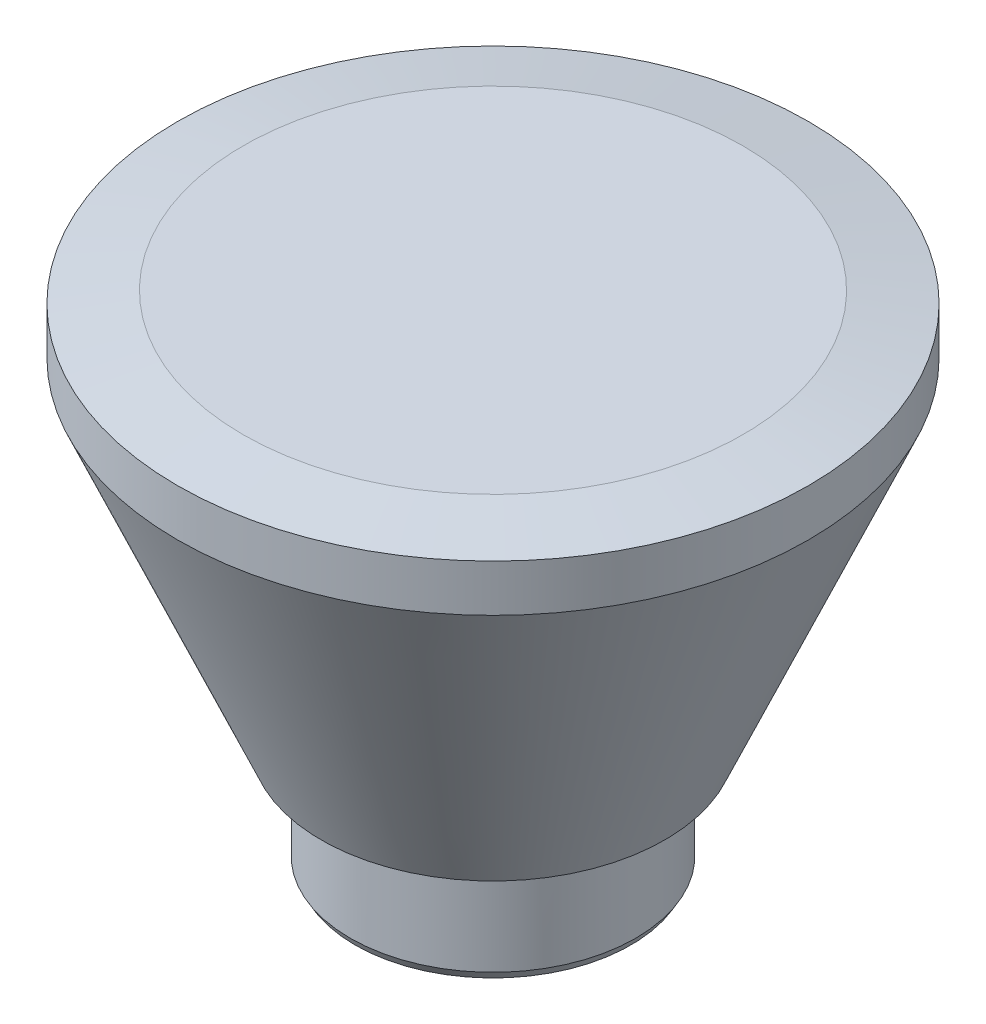
ISO-10303-21;
HEADER;
FILE_DESCRIPTION(('STEP AP214'),'2;1');
FILE_NAME('part.step','',(''),(''),'','','');
FILE_SCHEMA(('AUTOMOTIVE_DESIGN { 1 0 10303 214 1 1 1 1 }'));
ENDSEC;
DATA;
#1=APPLICATION_CONTEXT('core data for automotive mechanical design processes');
#2=APPLICATION_PROTOCOL_DEFINITION('international standard','automotive_design',2000,#1);
#3=PRODUCT_CONTEXT('',#1,'mechanical');
#4=PRODUCT('Part','Part','',(#3));
#5=PRODUCT_RELATED_PRODUCT_CATEGORY('part','',(#4));
#6=PRODUCT_DEFINITION_FORMATION('','',#4);
#7=PRODUCT_DEFINITION_CONTEXT('part definition',#1,'design');
#8=PRODUCT_DEFINITION('design','',#6,#7);
#9=PRODUCT_DEFINITION_SHAPE('','',#8);
#10=(LENGTH_UNIT() NAMED_UNIT(*) SI_UNIT(.MILLI.,.METRE.));
#11=(NAMED_UNIT(*) PLANE_ANGLE_UNIT() SI_UNIT($,.RADIAN.));
#12=(NAMED_UNIT(*) SI_UNIT($,.STERADIAN.) SOLID_ANGLE_UNIT());
#13=UNCERTAINTY_MEASURE_WITH_UNIT(LENGTH_MEASURE(1.E-05),#10,'distance_accuracy_value','');
#14=(GEOMETRIC_REPRESENTATION_CONTEXT(3) GLOBAL_UNCERTAINTY_ASSIGNED_CONTEXT((#13)) GLOBAL_UNIT_ASSIGNED_CONTEXT((#10,
#11,#12)) REPRESENTATION_CONTEXT('',''));
#15=CARTESIAN_POINT('',(0.,0.,0.));
#16=DIRECTION('',(0.,0.,1.));
#17=DIRECTION('',(1.,0.,0.));
#18=AXIS2_PLACEMENT_3D('',#15,#16,#17);
#19=CARTESIAN_POINT('',(0.,-1.57367102429958,0.));
#20=DIRECTION('',(0.,-1.,0.));
#21=DIRECTION('',(0.,0.,-1.));
#22=AXIS2_PLACEMENT_3D('',#19,#20,#21);
#23=CYLINDRICAL_SURFACE('',#22,19.);
#24=CARTESIAN_POINT('',(0.,22.4817362650327,0.));
#25=DIRECTION('',(0.,-1.,0.));
#26=DIRECTION('',(0.,0.,-1.));
#27=AXIS2_PLACEMENT_3D('',#24,#25,#26);
#28=CIRCLE('',#27,19.);
#29=CARTESIAN_POINT('',(0.,22.4817362650327,-19.));
#30=VERTEX_POINT('',#29);
#31=EDGE_CURVE('E245',#30,#30,#28,.T.);
#32=ORIENTED_EDGE('',*,*,#31,.T.);
#33=EDGE_LOOP('',(#32));
#34=FACE_BOUND('',#33,.T.);
#35=CARTESIAN_POINT('',(0.,19.6513289757004,0.));
#36=DIRECTION('',(0.,-1.,0.));
#37=DIRECTION('',(0.,0.,-1.));
#38=AXIS2_PLACEMENT_3D('',#35,#36,#37);
#39=CIRCLE('',#38,19.);
#40=CARTESIAN_POINT('',(0.,19.6513289757004,-19.));
#41=VERTEX_POINT('',#40);
#42=EDGE_CURVE('E273',#41,#41,#39,.T.);
#43=ORIENTED_EDGE('',*,*,#42,.F.);
#44=EDGE_LOOP('',(#43));
#45=FACE_BOUND('',#44,.T.);
#46=ADVANCED_FACE('F51',(#34,#45),#23,.T.);
#47=CARTESIAN_POINT('',(0.,19.6513289757004,0.));
#48=DIRECTION('',(0.,1.,0.));
#49=DIRECTION('',(0.,0.,1.));
#50=AXIS2_PLACEMENT_3D('',#47,#48,#49);
#51=CONICAL_SURFACE('',#50,19.,0.408661938833639);
#52=CARTESIAN_POINT('',(0.,-0.32367102429958,0.));
#53=DIRECTION('',(0.,-1.,0.));
#54=DIRECTION('',(0.,0.,-1.));
#55=AXIS2_PLACEMENT_3D('',#52,#53,#54);
#56=CIRCLE('',#55,10.35);
#57=CARTESIAN_POINT('',(0.,-0.32367102429958,-10.35));
#58=VERTEX_POINT('',#57);
#59=EDGE_CURVE('E269',#58,#58,#56,.T.);
#60=ORIENTED_EDGE('',*,*,#59,.F.);
#61=EDGE_LOOP('',(#60));
#62=FACE_BOUND('',#61,.T.);
#63=ORIENTED_EDGE('',*,*,#42,.T.);
#64=EDGE_LOOP('',(#63));
#65=FACE_BOUND('',#64,.T.);
#66=ADVANCED_FACE('F377',(#62,#65),#51,.T.);
#67=CARTESIAN_POINT('',(0.,-0.32367102429958,0.));
#68=DIRECTION('',(0.,1.,0.));
#69=DIRECTION('',(0.,0.,1.));
#70=AXIS2_PLACEMENT_3D('',#67,#68,#69);
#71=PLANE('',#70);
#72=CARTESIAN_POINT('',(0.,-0.32367102429958,0.));
#73=DIRECTION('',(0.,-1.,0.));
#74=DIRECTION('',(0.,0.,-1.));
#75=AXIS2_PLACEMENT_3D('',#72,#73,#74);
#76=CIRCLE('',#75,8.6);
#77=CARTESIAN_POINT('',(0.,-0.32367102429958,-8.6));
#78=VERTEX_POINT('',#77);
#79=EDGE_CURVE('E265',#78,#78,#76,.T.);
#80=ORIENTED_EDGE('',*,*,#79,.F.);
#81=EDGE_LOOP('',(#80));
#82=FACE_BOUND('',#81,.T.);
#83=ORIENTED_EDGE('',*,*,#59,.T.);
#84=EDGE_LOOP('',(#83));
#85=FACE_BOUND('',#84,.T.);
#86=ADVANCED_FACE('F373',(#82,#85),#71,.F.);
#87=CARTESIAN_POINT('',(0.,-1.57367102429958,0.));
#88=DIRECTION('',(0.,-1.,0.));
#89=DIRECTION('',(0.,0.,-1.));
#90=AXIS2_PLACEMENT_3D('',#87,#88,#89);
#91=CYLINDRICAL_SURFACE('',#90,8.6);
#92=CARTESIAN_POINT('',(0.,-6.3236710242996,0.));
#93=DIRECTION('',(0.,1.,0.));
#94=DIRECTION('',(0.,0.,1.));
#95=AXIS2_PLACEMENT_3D('',#92,#93,#94);
#96=CIRCLE('',#95,8.6);
#97=CARTESIAN_POINT('',(0.,-6.3236710242996,8.6));
#98=VERTEX_POINT('',#97);
#99=EDGE_CURVE('E11',#98,#98,#96,.T.);
#100=ORIENTED_EDGE('',*,*,#99,.T.);
#101=EDGE_LOOP('',(#100));
#102=FACE_BOUND('',#101,.T.);
#103=ORIENTED_EDGE('',*,*,#79,.T.);
#104=EDGE_LOOP('',(#103));
#105=FACE_BOUND('',#104,.T.);
#106=ADVANCED_FACE('F369',(#102,#105),#91,.T.);
#107=CARTESIAN_POINT('',(0.,-6.82367102429958,0.));
#108=DIRECTION('',(0.,1.,0.));
#109=DIRECTION('',(0.,0.,1.));
#110=AXIS2_PLACEMENT_3D('',#107,#108,#109);
#111=PLANE('',#110);
#112=CARTESIAN_POINT('',(0.,-6.82367102429958,0.));
#113=DIRECTION('',(0.,1.,0.));
#114=DIRECTION('',(0.,0.,1.));
#115=AXIS2_PLACEMENT_3D('',#112,#113,#114);
#116=CIRCLE('',#115,8.3113248654052);
#117=CARTESIAN_POINT('',(0.,-6.82367102429958,8.3113248654052));
#118=VERTEX_POINT('',#117);
#119=EDGE_CURVE('E61',#118,#118,#116,.F.);
#120=ORIENTED_EDGE('',*,*,#119,.T.);
#121=EDGE_LOOP('',(#120));
#122=FACE_BOUND('',#121,.T.);
#123=DIRECTION('',(-0.707106781186548,0.,-0.707106781186547));
#124=VECTOR('',#123,1.);
#125=CARTESIAN_POINT('',(7.,-6.82367102429958,-1.1));
#126=LINE('',#125,#124);
#127=CARTESIAN_POINT('',(7.,-6.82367102429958,-1.1));
#128=VERTEX_POINT('',#127);
#129=CARTESIAN_POINT('',(6.36894372506105,-6.82367102429958,-1.73105627493895));
#130=VERTEX_POINT('',#129);
#131=EDGE_CURVE('E170',#128,#130,#126,.T.);
#132=ORIENTED_EDGE('',*,*,#131,.T.);
#133=CARTESIAN_POINT('',(0.,-6.82367102429958,0.));
#134=DIRECTION('',(0.,1.,0.));
#135=DIRECTION('',(0.,0.,1.));
#136=AXIS2_PLACEMENT_3D('',#133,#134,#135);
#137=CIRCLE('',#136,6.6);
#138=CARTESIAN_POINT('',(6.36894372506105,-6.82367102429958,1.73105627493895));
#139=VERTEX_POINT('',#138);
#140=EDGE_CURVE('E76',#130,#139,#137,.T.);
#141=ORIENTED_EDGE('',*,*,#140,.T.);
#142=DIRECTION('',(0.707106781186548,0.,-0.707106781186547));
#143=VECTOR('',#142,1.);
#144=CARTESIAN_POINT('',(7.,-6.82367102429958,1.1));
#145=LINE('',#144,#143);
#146=CARTESIAN_POINT('',(7.,-6.82367102429958,1.1));
#147=VERTEX_POINT('',#146);
#148=EDGE_CURVE('E148',#139,#147,#145,.T.);
#149=ORIENTED_EDGE('',*,*,#148,.T.);
#150=DIRECTION('',(0.,0.,-1.));
#151=VECTOR('',#150,1.);
#152=CARTESIAN_POINT('',(7.,-6.82367102429958,-1.1));
#153=LINE('',#152,#151);
#154=EDGE_CURVE('E152',#147,#128,#153,.T.);
#155=ORIENTED_EDGE('',*,*,#154,.T.);
#156=EDGE_LOOP('',(#132,#141,#149,#155));
#157=FACE_BOUND('',#156,.T.);
#158=ADVANCED_FACE('F150',(#122,#157),#111,.F.);
#159=CARTESIAN_POINT('',(0.,-1.57367102429958,0.));
#160=DIRECTION('',(0.,-1.,0.));
#161=DIRECTION('',(0.,0.,-1.));
#162=AXIS2_PLACEMENT_3D('',#159,#160,#161);
#163=CYLINDRICAL_SURFACE('',#162,5.6);
#164=DIRECTION('',(0.,-1.,0.));
#165=VECTOR('',#164,1.);
#166=CARTESIAN_POINT('',(5.28559362796649,-1.57367102429958,1.85));
#167=LINE('',#166,#165);
#168=CARTESIAN_POINT('',(5.28559362796649,3.42632897570042,1.85));
#169=VERTEX_POINT('',#168);
#170=CARTESIAN_POINT('',(5.28559362796649,-5.82367102429958,1.85));
#171=VERTEX_POINT('',#170);
#172=EDGE_CURVE('E234',#169,#171,#167,.T.);
#173=ORIENTED_EDGE('',*,*,#172,.T.);
#174=CARTESIAN_POINT('',(0.,-5.82367102429958,0.));
#175=DIRECTION('',(0.,1.,0.));
#176=DIRECTION('',(0.,0.,1.));
#177=AXIS2_PLACEMENT_3D('',#174,#175,#176);
#178=CIRCLE('',#177,5.6);
#179=CARTESIAN_POINT('',(5.28559362796649,-5.82367102429958,-1.85));
#180=VERTEX_POINT('',#179);
#181=EDGE_CURVE('E297',#171,#180,#178,.F.);
#182=ORIENTED_EDGE('',*,*,#181,.T.);
#183=DIRECTION('',(0.,-1.,0.));
#184=VECTOR('',#183,1.);
#185=CARTESIAN_POINT('',(5.28559362796649,-1.57367102429958,-1.85));
#186=LINE('',#185,#184);
#187=CARTESIAN_POINT('',(5.28559362796649,3.42632897570042,-1.85));
#188=VERTEX_POINT('',#187);
#189=EDGE_CURVE('E242',#180,#188,#186,.F.);
#190=ORIENTED_EDGE('',*,*,#189,.T.);
#191=CARTESIAN_POINT('',(0.,3.42632897570042,0.));
#192=DIRECTION('',(0.,-1.,0.));
#193=DIRECTION('',(0.,0.,-1.));
#194=AXIS2_PLACEMENT_3D('',#191,#192,#193);
#195=CIRCLE('',#194,5.6);
#196=EDGE_CURVE('E261',#169,#188,#195,.T.);
#197=ORIENTED_EDGE('',*,*,#196,.F.);
#198=EDGE_LOOP('',(#173,#182,#190,#197));
#199=FACE_BOUND('',#198,.T.);
#200=ADVANCED_FACE('F362',(#199),#163,.F.);
#201=CARTESIAN_POINT('',(0.,3.42632897570042,0.));
#202=DIRECTION('',(0.,1.,0.));
#203=DIRECTION('',(0.,0.,1.));
#204=AXIS2_PLACEMENT_3D('',#201,#202,#203);
#205=PLANE('',#204);
#206=DIRECTION('',(1.,0.,0.));
#207=VECTOR('',#206,1.);
#208=CARTESIAN_POINT('',(6.25,3.42632897570042,-1.85));
#209=LINE('',#208,#207);
#210=CARTESIAN_POINT('',(0.750000000000002,3.42632897570042,-1.85));
#211=VERTEX_POINT('',#210);
#212=CARTESIAN_POINT('',(2.36167313572391,3.42632897570042,-1.85));
#213=VERTEX_POINT('',#212);
#214=EDGE_CURVE('E196',#211,#213,#209,.T.);
#215=ORIENTED_EDGE('',*,*,#214,.T.);
#216=CARTESIAN_POINT('',(0.,3.42632897570042,0.));
#217=DIRECTION('',(0.,-1.,0.));
#218=DIRECTION('',(0.,0.,-1.));
#219=AXIS2_PLACEMENT_3D('',#216,#217,#218);
#220=CIRCLE('',#219,3.);
#221=CARTESIAN_POINT('',(2.36167313572391,3.42632897570042,1.85));
#222=VERTEX_POINT('',#221);
#223=EDGE_CURVE('E257',#222,#213,#220,.T.);
#224=ORIENTED_EDGE('',*,*,#223,.F.);
#225=DIRECTION('',(-1.,0.,0.));
#226=VECTOR('',#225,1.);
#227=CARTESIAN_POINT('',(6.25,3.42632897570042,1.85));
#228=LINE('',#227,#226);
#229=CARTESIAN_POINT('',(0.750000000000004,3.42632897570042,1.85));
#230=VERTEX_POINT('',#229);
#231=EDGE_CURVE('E185',#222,#230,#228,.T.);
#232=ORIENTED_EDGE('',*,*,#231,.T.);
#233=DIRECTION('',(-0.707106781186548,0.,-0.707106781186548));
#234=VECTOR('',#233,1.);
#235=CARTESIAN_POINT('',(0.750000000000004,3.42632897570042,1.85));
#236=LINE('',#235,#234);
#237=CARTESIAN_POINT('',(0.,3.42632897570042,1.1));
#238=VERTEX_POINT('',#237);
#239=EDGE_CURVE('E173',#230,#238,#236,.T.);
#240=ORIENTED_EDGE('',*,*,#239,.T.);
#241=DIRECTION('',(0.,0.,-1.));
#242=VECTOR('',#241,1.);
#243=CARTESIAN_POINT('',(0.,3.42632897570042,-1.1));
#244=LINE('',#243,#242);
#245=CARTESIAN_POINT('',(0.,3.42632897570042,-1.1));
#246=VERTEX_POINT('',#245);
#247=EDGE_CURVE('E207',#238,#246,#244,.T.);
#248=ORIENTED_EDGE('',*,*,#247,.T.);
#249=DIRECTION('',(0.707106781186547,0.,-0.707106781186548));
#250=VECTOR('',#249,1.);
#251=CARTESIAN_POINT('',(0.750000000000002,3.42632897570042,-1.85));
#252=LINE('',#251,#250);
#253=EDGE_CURVE('E201',#246,#211,#252,.T.);
#254=ORIENTED_EDGE('',*,*,#253,.T.);
#255=EDGE_LOOP('',(#215,#224,#232,#240,#248,#254));
#256=FACE_BOUND('',#255,.T.);
#257=ORIENTED_EDGE('',*,*,#196,.T.);
#258=CARTESIAN_POINT('',(6.25,3.42632897570042,-1.85));
#259=VERTEX_POINT('',#258);
#260=EDGE_CURVE('E200',#188,#259,#209,.T.);
#261=ORIENTED_EDGE('',*,*,#260,.T.);
#262=DIRECTION('',(0.707106781186548,0.,0.707106781186547));
#263=VECTOR('',#262,1.);
#264=CARTESIAN_POINT('',(7.,3.42632897570042,-1.1));
#265=LINE('',#264,#263);
#266=CARTESIAN_POINT('',(7.,3.42632897570042,-1.1));
#267=VERTEX_POINT('',#266);
#268=EDGE_CURVE('E191',#259,#267,#265,.T.);
#269=ORIENTED_EDGE('',*,*,#268,.T.);
#270=DIRECTION('',(0.,0.,1.));
#271=VECTOR('',#270,1.);
#272=CARTESIAN_POINT('',(7.,3.42632897570042,-1.1));
#273=LINE('',#272,#271);
#274=CARTESIAN_POINT('',(7.,3.42632897570042,1.1));
#275=VERTEX_POINT('',#274);
#276=EDGE_CURVE('E163',#267,#275,#273,.T.);
#277=ORIENTED_EDGE('',*,*,#276,.T.);
#278=DIRECTION('',(-0.707106781186548,0.,0.707106781186547));
#279=VECTOR('',#278,1.);
#280=CARTESIAN_POINT('',(7.,3.42632897570042,1.1));
#281=LINE('',#280,#279);
#282=CARTESIAN_POINT('',(6.25,3.42632897570042,1.85));
#283=VERTEX_POINT('',#282);
#284=EDGE_CURVE('E159',#275,#283,#281,.T.);
#285=ORIENTED_EDGE('',*,*,#284,.T.);
#286=EDGE_CURVE('E180',#283,#169,#228,.T.);
#287=ORIENTED_EDGE('',*,*,#286,.T.);
#288=EDGE_LOOP('',(#257,#261,#269,#277,#285,#287));
#289=FACE_BOUND('',#288,.T.);
#290=ADVANCED_FACE('F358',(#256,#289),#205,.F.);
#291=CARTESIAN_POINT('',(0.,-1.57367102429958,0.));
#292=DIRECTION('',(0.,-1.,0.));
#293=DIRECTION('',(0.,0.,-1.));
#294=AXIS2_PLACEMENT_3D('',#291,#292,#293);
#295=CYLINDRICAL_SURFACE('',#294,3.);
#296=ORIENTED_EDGE('',*,*,#223,.T.);
#297=DIRECTION('',(0.,-1.,0.));
#298=VECTOR('',#297,1.);
#299=CARTESIAN_POINT('',(2.36167313572391,-1.57367102429958,-1.85));
#300=LINE('',#299,#298);
#301=CARTESIAN_POINT('',(2.36167313572391,-1.57367102429958,-1.85));
#302=VERTEX_POINT('',#301);
#303=EDGE_CURVE('E238',#213,#302,#300,.T.);
#304=ORIENTED_EDGE('',*,*,#303,.T.);
#305=CARTESIAN_POINT('',(0.,-1.57367102429958,0.));
#306=DIRECTION('',(0.,-1.,0.));
#307=DIRECTION('',(0.,0.,-1.));
#308=AXIS2_PLACEMENT_3D('',#305,#306,#307);
#309=CIRCLE('',#308,3.);
#310=CARTESIAN_POINT('',(2.36167313572391,-1.57367102429958,1.85));
#311=VERTEX_POINT('',#310);
#312=EDGE_CURVE('E253',#311,#302,#309,.T.);
#313=ORIENTED_EDGE('',*,*,#312,.F.);
#314=DIRECTION('',(0.,-1.,0.));
#315=VECTOR('',#314,1.);
#316=CARTESIAN_POINT('',(2.36167313572391,-1.57367102429958,1.85));
#317=LINE('',#316,#315);
#318=EDGE_CURVE('E230',#311,#222,#317,.F.);
#319=ORIENTED_EDGE('',*,*,#318,.T.);
#320=EDGE_LOOP('',(#296,#304,#313,#319));
#321=FACE_BOUND('',#320,.T.);
#322=ADVANCED_FACE('F354',(#321),#295,.T.);
#323=CARTESIAN_POINT('',(0.,-1.57367102429958,0.));
#324=DIRECTION('',(0.,1.,0.));
#325=DIRECTION('',(0.,0.,1.));
#326=AXIS2_PLACEMENT_3D('',#323,#324,#325);
#327=PLANE('',#326);
#328=ORIENTED_EDGE('',*,*,#312,.T.);
#329=DIRECTION('',(-1.,0.,0.));
#330=VECTOR('',#329,1.);
#331=CARTESIAN_POINT('',(0.,-1.57367102429958,-1.85));
#332=LINE('',#331,#330);
#333=CARTESIAN_POINT('',(0.750000000000002,-1.57367102429958,-1.85));
#334=VERTEX_POINT('',#333);
#335=EDGE_CURVE('E293',#302,#334,#332,.T.);
#336=ORIENTED_EDGE('',*,*,#335,.T.);
#337=DIRECTION('',(-0.707106781186547,0.,0.707106781186548));
#338=VECTOR('',#337,1.);
#339=CARTESIAN_POINT('',(-0.55,-1.57367102429958,-0.549999999999999));
#340=LINE('',#339,#338);
#341=CARTESIAN_POINT('',(0.,-1.57367102429958,-1.1));
#342=VERTEX_POINT('',#341);
#343=EDGE_CURVE('E289',#334,#342,#340,.T.);
#344=ORIENTED_EDGE('',*,*,#343,.T.);
#345=DIRECTION('',(0.,0.,1.));
#346=VECTOR('',#345,1.);
#347=CARTESIAN_POINT('',(0.,-1.57367102429958,0.));
#348=LINE('',#347,#346);
#349=CARTESIAN_POINT('',(0.,-1.57367102429958,1.1));
#350=VERTEX_POINT('',#349);
#351=EDGE_CURVE('E285',#342,#350,#348,.T.);
#352=ORIENTED_EDGE('',*,*,#351,.T.);
#353=DIRECTION('',(0.707106781186548,0.,0.707106781186548));
#354=VECTOR('',#353,1.);
#355=CARTESIAN_POINT('',(-0.55,-1.57367102429958,0.55));
#356=LINE('',#355,#354);
#357=CARTESIAN_POINT('',(0.750000000000004,-1.57367102429958,1.85));
#358=VERTEX_POINT('',#357);
#359=EDGE_CURVE('E281',#350,#358,#356,.T.);
#360=ORIENTED_EDGE('',*,*,#359,.T.);
#361=DIRECTION('',(1.,0.,0.));
#362=VECTOR('',#361,1.);
#363=CARTESIAN_POINT('',(0.,-1.57367102429958,1.85));
#364=LINE('',#363,#362);
#365=EDGE_CURVE('E277',#358,#311,#364,.T.);
#366=ORIENTED_EDGE('',*,*,#365,.T.);
#367=EDGE_LOOP('',(#328,#336,#344,#352,#360,#366));
#368=FACE_BOUND('',#367,.T.);
#369=ADVANCED_FACE('F350',(#368),#327,.F.);
#370=CARTESIAN_POINT('',(0.,23.1763289757004,0.));
#371=DIRECTION('',(0.,-1.,0.));
#372=DIRECTION('',(0.,0.,-1.));
#373=AXIS2_PLACEMENT_3D('',#370,#371,#372);
#374=PLANE('',#373);
#375=CARTESIAN_POINT('',(0.,23.1763289757004,0.));
#376=DIRECTION('',(0.,-1.,0.));
#377=DIRECTION('',(0.,0.,-1.));
#378=AXIS2_PLACEMENT_3D('',#375,#376,#377);
#379=CIRCLE('',#378,15.0607689879512);
#380=CARTESIAN_POINT('',(0.,23.1763289757004,-15.0607689879512));
#381=VERTEX_POINT('',#380);
#382=EDGE_CURVE('E249',#381,#381,#379,.T.);
#383=ORIENTED_EDGE('',*,*,#382,.F.);
#384=EDGE_LOOP('',(#383));
#385=FACE_BOUND('',#384,.T.);
#386=ADVANCED_FACE('F346',(#385),#374,.F.);
#387=CARTESIAN_POINT('',(0.,22.4817362650327,0.));
#388=DIRECTION('',(0.,-1.,0.));
#389=DIRECTION('',(0.,0.,-1.));
#390=AXIS2_PLACEMENT_3D('',#387,#388,#389);
#391=CONICAL_SURFACE('',#390,19.,1.39626340159547);
#392=ORIENTED_EDGE('',*,*,#382,.T.);
#393=EDGE_LOOP('',(#392));
#394=FACE_BOUND('',#393,.T.);
#395=ORIENTED_EDGE('',*,*,#31,.F.);
#396=EDGE_LOOP('',(#395));
#397=FACE_BOUND('',#396,.T.);
#398=ADVANCED_FACE('F342',(#394,#397),#391,.T.);
#399=CARTESIAN_POINT('',(6.25,11.3440306624274,1.85));
#400=DIRECTION('',(0.,0.,1.));
#401=DIRECTION('',(1.,0.,0.));
#402=AXIS2_PLACEMENT_3D('',#399,#400,#401);
#403=PLANE('',#402);
#404=ORIENTED_EDGE('',*,*,#365,.F.);
#405=DIRECTION('',(0.,-1.,0.));
#406=VECTOR('',#405,1.);
#407=CARTESIAN_POINT('',(0.750000000000004,11.3440306624274,1.85));
#408=LINE('',#407,#406);
#409=EDGE_CURVE('E184',#230,#358,#408,.T.);
#410=ORIENTED_EDGE('',*,*,#409,.F.);
#411=ORIENTED_EDGE('',*,*,#231,.F.);
#412=ORIENTED_EDGE('',*,*,#318,.F.);
#413=EDGE_LOOP('',(#404,#410,#411,#412));
#414=FACE_BOUND('',#413,.T.);
#415=ADVANCED_FACE('F345',(#414),#403,.F.);
#416=CARTESIAN_POINT('',(6.25,11.3440306624274,-1.85));
#417=DIRECTION('',(0.,0.,-1.));
#418=DIRECTION('',(-1.,0.,0.));
#419=AXIS2_PLACEMENT_3D('',#416,#417,#418);
#420=PLANE('',#419);
#421=ORIENTED_EDGE('',*,*,#214,.F.);
#422=DIRECTION('',(0.,-1.,0.));
#423=VECTOR('',#422,1.);
#424=CARTESIAN_POINT('',(0.750000000000002,11.3440306624274,-1.85));
#425=LINE('',#424,#423);
#426=EDGE_CURVE('E205',#211,#334,#425,.T.);
#427=ORIENTED_EDGE('',*,*,#426,.T.);
#428=ORIENTED_EDGE('',*,*,#335,.F.);
#429=ORIENTED_EDGE('',*,*,#303,.F.);
#430=EDGE_LOOP('',(#421,#427,#428,#429));
#431=FACE_BOUND('',#430,.T.);
#432=ADVANCED_FACE('F327',(#431),#420,.F.);
#433=CARTESIAN_POINT('',(0.750000000000002,11.3440306624274,-1.85));
#434=DIRECTION('',(-0.707106781186548,0.,-0.707106781186547));
#435=DIRECTION('',(-0.707106781186547,0.,0.707106781186548));
#436=AXIS2_PLACEMENT_3D('',#433,#434,#435);
#437=PLANE('',#436);
#438=ORIENTED_EDGE('',*,*,#426,.F.);
#439=ORIENTED_EDGE('',*,*,#253,.F.);
#440=DIRECTION('',(0.,-1.,0.));
#441=VECTOR('',#440,1.);
#442=CARTESIAN_POINT('',(0.,11.3440306624274,-1.1));
#443=LINE('',#442,#441);
#444=EDGE_CURVE('E206',#246,#342,#443,.T.);
#445=ORIENTED_EDGE('',*,*,#444,.T.);
#446=ORIENTED_EDGE('',*,*,#343,.F.);
#447=EDGE_LOOP('',(#438,#439,#445,#446));
#448=FACE_BOUND('',#447,.T.);
#449=ADVANCED_FACE('F331',(#448),#437,.F.);
#450=CARTESIAN_POINT('',(0.,11.3440306624274,-1.1));
#451=DIRECTION('',(-1.,0.,0.));
#452=DIRECTION('',(0.,0.,1.));
#453=AXIS2_PLACEMENT_3D('',#450,#451,#452);
#454=PLANE('',#453);
#455=ORIENTED_EDGE('',*,*,#444,.F.);
#456=ORIENTED_EDGE('',*,*,#247,.F.);
#457=DIRECTION('',(0.,-1.,0.));
#458=VECTOR('',#457,1.);
#459=CARTESIAN_POINT('',(0.,11.3440306624274,1.1));
#460=LINE('',#459,#458);
#461=EDGE_CURVE('E179',#238,#350,#460,.T.);
#462=ORIENTED_EDGE('',*,*,#461,.T.);
#463=ORIENTED_EDGE('',*,*,#351,.F.);
#464=EDGE_LOOP('',(#455,#456,#462,#463));
#465=FACE_BOUND('',#464,.T.);
#466=ADVANCED_FACE('F334',(#465),#454,.F.);
#467=CARTESIAN_POINT('',(0.750000000000004,11.3440306624274,1.85));
#468=DIRECTION('',(-0.707106781186547,0.,0.707106781186547));
#469=DIRECTION('',(0.707106781186548,0.,0.707106781186548));
#470=AXIS2_PLACEMENT_3D('',#467,#468,#469);
#471=PLANE('',#470);
#472=ORIENTED_EDGE('',*,*,#461,.F.);
#473=ORIENTED_EDGE('',*,*,#239,.F.);
#474=ORIENTED_EDGE('',*,*,#409,.T.);
#475=ORIENTED_EDGE('',*,*,#359,.F.);
#476=EDGE_LOOP('',(#472,#473,#474,#475));
#477=FACE_BOUND('',#476,.T.);
#478=ADVANCED_FACE('F325',(#477),#471,.F.);
#479=ORIENTED_EDGE('',*,*,#189,.F.);
#480=CARTESIAN_POINT('',(5.28559362796649,-5.82367102429958,-1.85));
#481=CARTESIAN_POINT('',(5.36628547886081,-5.89983370036859,-1.85));
#482=CARTESIAN_POINT('',(5.44688346656384,-5.97609571889041,-1.85));
#483=CARTESIAN_POINT('',(5.60791103759497,-6.12879673830204,-1.85));
#484=CARTESIAN_POINT('',(5.68834062156971,-6.2052357385099,-1.85));
#485=CARTESIAN_POINT('',(5.84905126260502,-6.35826954310243,-1.85));
#486=CARTESIAN_POINT('',(5.92933231978581,-6.4348643473609,-1.85));
#487=CARTESIAN_POINT('',(6.08976181675327,-6.58819334142252,-1.85));
#488=CARTESIAN_POINT('',(6.16991025602906,-6.66492753176025,-1.85));
#489=CARTESIAN_POINT('',(6.25,-6.74172288049096,-1.85));
#490=B_SPLINE_CURVE_WITH_KNOTS('',3,(#480,#481,#482,#483,#484,#485,#486,#487,#488,#489),
.UNSPECIFIED.,.F.,.F.,(4,2,2,2,4),(0.,0.332877197810179,0.665753115085357,0.998628762818328,
1.33150568990946),.UNSPECIFIED.);
#491=CARTESIAN_POINT('',(6.25,-6.74172288049096,-1.85));
#492=VERTEX_POINT('',#491);
#493=EDGE_CURVE('E301',#180,#492,#490,.T.);
#494=ORIENTED_EDGE('',*,*,#493,.T.);
#495=DIRECTION('',(0.,-1.,0.));
#496=VECTOR('',#495,1.);
#497=CARTESIAN_POINT('',(6.25,11.3440306624274,-1.85));
#498=LINE('',#497,#496);
#499=EDGE_CURVE('E195',#259,#492,#498,.T.);
#500=ORIENTED_EDGE('',*,*,#499,.F.);
#501=ORIENTED_EDGE('',*,*,#260,.F.);
#502=EDGE_LOOP('',(#479,#494,#500,#501));
#503=FACE_BOUND('',#502,.T.);
#504=ADVANCED_FACE('F320',(#503),#420,.F.);
#505=DIRECTION('',(0.,-1.,0.));
#506=VECTOR('',#505,1.);
#507=CARTESIAN_POINT('',(6.25,11.3440306624274,1.85));
#508=LINE('',#507,#506);
#509=CARTESIAN_POINT('',(6.25,-6.74172288049097,1.85));
#510=VERTEX_POINT('',#509);
#511=EDGE_CURVE('E188',#283,#510,#508,.T.);
#512=ORIENTED_EDGE('',*,*,#511,.T.);
#513=CARTESIAN_POINT('',(6.25,-6.74172288049096,1.85));
#514=CARTESIAN_POINT('',(6.16991025602906,-6.66492753176025,1.85));
#515=CARTESIAN_POINT('',(6.08976181675327,-6.58819334142252,1.85));
#516=CARTESIAN_POINT('',(5.92933231978581,-6.4348643473609,1.85));
#517=CARTESIAN_POINT('',(5.84905126260502,-6.35826954310243,1.85));
#518=CARTESIAN_POINT('',(5.68834062156971,-6.2052357385099,1.85));
#519=CARTESIAN_POINT('',(5.60791103759497,-6.12879673830204,1.85));
#520=CARTESIAN_POINT('',(5.44688346656384,-5.97609571889041,1.85));
#521=CARTESIAN_POINT('',(5.36628547886081,-5.89983370036859,1.85));
#522=CARTESIAN_POINT('',(5.28559362796649,-5.82367102429958,1.85));
#523=B_SPLINE_CURVE_WITH_KNOTS('',3,(#513,#514,#515,#516,#517,#518,#519,#520,#521,#522),
.UNSPECIFIED.,.F.,.F.,(4,2,2,2,4),(0.,0.332876927091134,0.665752574824105,0.998628492099284,
1.33150568990946),.UNSPECIFIED.);
#524=EDGE_CURVE('E550',#510,#171,#523,.T.);
#525=ORIENTED_EDGE('',*,*,#524,.T.);
#526=ORIENTED_EDGE('',*,*,#172,.F.);
#527=ORIENTED_EDGE('',*,*,#286,.F.);
#528=EDGE_LOOP('',(#512,#525,#526,#527));
#529=FACE_BOUND('',#528,.T.);
#530=ADVANCED_FACE('F324',(#529),#403,.F.);
#531=CARTESIAN_POINT('',(7.,11.3440306624274,-1.1));
#532=DIRECTION('',(0.707106781186547,0.,-0.707106781186548));
#533=DIRECTION('',(-0.707106781186548,0.,-0.707106781186547));
#534=AXIS2_PLACEMENT_3D('',#531,#532,#533);
#535=PLANE('',#534);
#536=ORIENTED_EDGE('',*,*,#499,.T.);
#537=CARTESIAN_POINT('',(6.25,-6.74172288049096,-1.85));
#538=CARTESIAN_POINT('',(6.26990028900059,-6.75515931887587,-1.83009971099941));
#539=CARTESIAN_POINT('',(6.28976241155268,-6.76870655072948,-1.81023758844732));
#540=CARTESIAN_POINT('',(6.32941031989147,-6.79602259870892,-1.77058968010853));
#541=CARTESIAN_POINT('',(6.34919610569306,-6.80979141479152,-1.75080389430694));
#542=CARTESIAN_POINT('',(6.36894372506105,-6.82367102429958,-1.73105627493895));
#543=B_SPLINE_CURVE_WITH_KNOTS('',3,(#537,#538,#539,#540,#541,#542),.UNSPECIFIED.,.F.,.F.,(4,2,
4),(0.,0.0935564954398876,0.187112972623495),.UNSPECIFIED.);
#544=EDGE_CURVE('E309',#492,#130,#543,.T.);
#545=ORIENTED_EDGE('',*,*,#544,.T.);
#546=ORIENTED_EDGE('',*,*,#131,.F.);
#547=DIRECTION('',(0.,-1.,0.));
#548=VECTOR('',#547,1.);
#549=CARTESIAN_POINT('',(7.,11.3440306624274,-1.1));
#550=LINE('',#549,#548);
#551=EDGE_CURVE('E167',#267,#128,#550,.T.);
#552=ORIENTED_EDGE('',*,*,#551,.F.);
#553=ORIENTED_EDGE('',*,*,#268,.F.);
#554=EDGE_LOOP('',(#536,#545,#546,#552,#553));
#555=FACE_BOUND('',#554,.T.);
#556=ADVANCED_FACE('F328',(#555),#535,.F.);
#557=CARTESIAN_POINT('',(7.,11.3440306624274,-1.1));
#558=DIRECTION('',(1.,0.,0.));
#559=DIRECTION('',(0.,0.,-1.));
#560=AXIS2_PLACEMENT_3D('',#557,#558,#559);
#561=PLANE('',#560);
#562=ORIENTED_EDGE('',*,*,#551,.T.);
#563=ORIENTED_EDGE('',*,*,#154,.F.);
#564=DIRECTION('',(0.,-1.,0.));
#565=VECTOR('',#564,1.);
#566=CARTESIAN_POINT('',(7.,11.3440306624274,1.1));
#567=LINE('',#566,#565);
#568=EDGE_CURVE('E156',#275,#147,#567,.T.);
#569=ORIENTED_EDGE('',*,*,#568,.F.);
#570=ORIENTED_EDGE('',*,*,#276,.F.);
#571=EDGE_LOOP('',(#562,#563,#569,#570));
#572=FACE_BOUND('',#571,.T.);
#573=ADVANCED_FACE('F165',(#572),#561,.F.);
#574=CARTESIAN_POINT('',(7.,11.3440306624274,1.1));
#575=DIRECTION('',(0.707106781186547,0.,0.707106781186548));
#576=DIRECTION('',(0.707106781186548,0.,-0.707106781186547));
#577=AXIS2_PLACEMENT_3D('',#574,#575,#576);
#578=PLANE('',#577);
#579=ORIENTED_EDGE('',*,*,#148,.F.);
#580=CARTESIAN_POINT('',(6.36894372506105,-6.82367102429958,1.73105627493895));
#581=CARTESIAN_POINT('',(6.34919610569306,-6.80979141479152,1.75080389430694));
#582=CARTESIAN_POINT('',(6.32941031989147,-6.79602259870892,1.77058968010853));
#583=CARTESIAN_POINT('',(6.28976241155268,-6.76870655072948,1.81023758844732));
#584=CARTESIAN_POINT('',(6.26990028900059,-6.75515931887587,1.83009971099941));
#585=CARTESIAN_POINT('',(6.25,-6.74172288049096,1.85));
#586=B_SPLINE_CURVE_WITH_KNOTS('',3,(#580,#581,#582,#583,#584,#585),.UNSPECIFIED.,.F.,.F.,(4,2,
4),(0.,0.0935564771836063,0.187112972623494),.UNSPECIFIED.);
#587=EDGE_CURVE('E68',#139,#510,#586,.T.);
#588=ORIENTED_EDGE('',*,*,#587,.T.);
#589=ORIENTED_EDGE('',*,*,#511,.F.);
#590=ORIENTED_EDGE('',*,*,#284,.F.);
#591=ORIENTED_EDGE('',*,*,#568,.T.);
#592=EDGE_LOOP('',(#579,#588,#589,#590,#591));
#593=FACE_BOUND('',#592,.T.);
#594=ADVANCED_FACE('F157',(#593),#578,.F.);
#595=CARTESIAN_POINT('',(0.,-5.82367102429958,0.));
#596=DIRECTION('',(0.,-1.,0.));
#597=DIRECTION('',(0.,0.,-1.));
#598=AXIS2_PLACEMENT_3D('',#595,#596,#597);
#599=CONICAL_SURFACE('',#598,5.6,0.785398163397449);
#600=ORIENTED_EDGE('',*,*,#587,.F.);
#601=ORIENTED_EDGE('',*,*,#140,.F.);
#602=ORIENTED_EDGE('',*,*,#544,.F.);
#603=ORIENTED_EDGE('',*,*,#493,.F.);
#604=ORIENTED_EDGE('',*,*,#181,.F.);
#605=ORIENTED_EDGE('',*,*,#524,.F.);
#606=EDGE_LOOP('',(#600,#601,#602,#603,#604,#605));
#607=FACE_BOUND('',#606,.T.);
#608=ADVANCED_FACE('F317',(#607),#599,.F.);
#609=CARTESIAN_POINT('',(0.,-6.82367102429958,0.));
#610=DIRECTION('',(0.,1.,0.));
#611=DIRECTION('',(0.,0.,1.));
#612=AXIS2_PLACEMENT_3D('',#609,#610,#611);
#613=CONICAL_SURFACE('',#612,8.3113248654052,0.523598775598298);
#614=ORIENTED_EDGE('',*,*,#99,.F.);
#615=EDGE_LOOP('',(#614));
#616=FACE_BOUND('',#615,.T.);
#617=ORIENTED_EDGE('',*,*,#119,.F.);
#618=EDGE_LOOP('',(#617));
#619=FACE_BOUND('',#618,.T.);
#620=ADVANCED_FACE('F54',(#616,#619),#613,.T.);
#621=CLOSED_SHELL('',(#46,#66,#86,#106,#158,#200,#290,#322,#369,#386,#398,#415,#432,#449,#466,
#478,#504,#530,#556,#573,#594,#608,#620));
#622=MANIFOLD_SOLID_BREP('B2',#621);
#623=ADVANCED_BREP_SHAPE_REPRESENTATION('',(#18,#622),#14);
#624=SHAPE_DEFINITION_REPRESENTATION(#9,#623);
ENDSEC;
END-ISO-10303-21;
